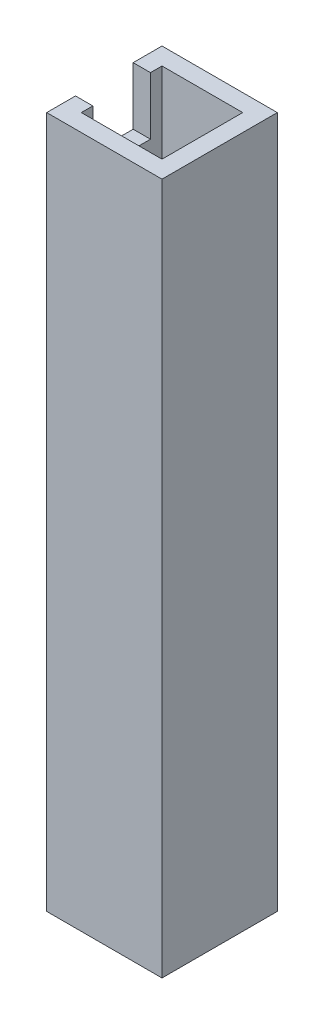
ISO-10303-21;
HEADER;
FILE_DESCRIPTION(('STEP AP214'),'2;1');
FILE_NAME('part.step','',(''),(''),'','','');
FILE_SCHEMA(('AUTOMOTIVE_DESIGN { 1 0 10303 214 1 1 1 1 }'));
ENDSEC;
DATA;
#1=APPLICATION_CONTEXT('core data for automotive mechanical design processes');
#2=APPLICATION_PROTOCOL_DEFINITION('international standard','automotive_design',2000,#1);
#3=PRODUCT_CONTEXT('',#1,'mechanical');
#4=PRODUCT('Part','Part','',(#3));
#5=PRODUCT_RELATED_PRODUCT_CATEGORY('part','',(#4));
#6=PRODUCT_DEFINITION_FORMATION('','',#4);
#7=PRODUCT_DEFINITION_CONTEXT('part definition',#1,'design');
#8=PRODUCT_DEFINITION('design','',#6,#7);
#9=PRODUCT_DEFINITION_SHAPE('','',#8);
#10=(LENGTH_UNIT() NAMED_UNIT(*) SI_UNIT(.MILLI.,.METRE.));
#11=(NAMED_UNIT(*) PLANE_ANGLE_UNIT() SI_UNIT($,.RADIAN.));
#12=(NAMED_UNIT(*) SI_UNIT($,.STERADIAN.) SOLID_ANGLE_UNIT());
#13=UNCERTAINTY_MEASURE_WITH_UNIT(LENGTH_MEASURE(1.E-05),#10,'distance_accuracy_value','');
#14=(GEOMETRIC_REPRESENTATION_CONTEXT(3) GLOBAL_UNCERTAINTY_ASSIGNED_CONTEXT((#13)) GLOBAL_UNIT_ASSIGNED_CONTEXT((#10,
#11,#12)) REPRESENTATION_CONTEXT('',''));
#15=CARTESIAN_POINT('',(0.,0.,0.));
#16=DIRECTION('',(0.,0.,1.));
#17=DIRECTION('',(1.,0.,0.));
#18=AXIS2_PLACEMENT_3D('',#15,#16,#17);
#19=CARTESIAN_POINT('',(0.,120.,0.));
#20=DIRECTION('',(0.,1.,0.));
#21=DIRECTION('',(0.,0.,1.));
#22=AXIS2_PLACEMENT_3D('',#19,#20,#21);
#23=PLANE('',#22);
#24=DIRECTION('',(0.,0.,1.));
#25=VECTOR('',#24,1.);
#26=CARTESIAN_POINT('',(-5.07339449541285,120.,-5.01529051987768));
#27=LINE('',#26,#25);
#28=CARTESIAN_POINT('',(-5.07339449541284,120.,9.98470948012232));
#29=VERTEX_POINT('',#28);
#30=CARTESIAN_POINT('',(-5.07339449541284,120.,11.9847094801223));
#31=VERTEX_POINT('',#30);
#32=EDGE_CURVE('E185',#29,#31,#27,.T.);
#33=ORIENTED_EDGE('',*,*,#32,.F.);
#34=DIRECTION('',(-1.,0.,0.));
#35=VECTOR('',#34,1.);
#36=CARTESIAN_POINT('',(-5.07339449541284,120.,9.98470948012232));
#37=LINE('',#36,#35);
#38=CARTESIAN_POINT('',(-8.07339449541284,120.,9.98470948012232));
#39=VERTEX_POINT('',#38);
#40=EDGE_CURVE('E161',#29,#39,#37,.T.);
#41=ORIENTED_EDGE('',*,*,#40,.T.);
#42=DIRECTION('',(0.,0.,1.));
#43=VECTOR('',#42,1.);
#44=CARTESIAN_POINT('',(-8.07339449541285,120.,-5.01529051987768));
#45=LINE('',#44,#43);
#46=CARTESIAN_POINT('',(-8.07339449541284,120.,14.9847094801223));
#47=VERTEX_POINT('',#46);
#48=EDGE_CURVE('E196',#39,#47,#45,.T.);
#49=ORIENTED_EDGE('',*,*,#48,.T.);
#50=DIRECTION('',(1.,0.,0.));
#51=VECTOR('',#50,1.);
#52=CARTESIAN_POINT('',(-8.07339449541284,120.,14.9847094801223));
#53=LINE('',#52,#51);
#54=CARTESIAN_POINT('',(11.9266055045872,120.,14.9847094801223));
#55=VERTEX_POINT('',#54);
#56=EDGE_CURVE('E197',#47,#55,#53,.T.);
#57=ORIENTED_EDGE('',*,*,#56,.T.);
#58=DIRECTION('',(0.,0.,-1.));
#59=VECTOR('',#58,1.);
#60=CARTESIAN_POINT('',(11.9266055045872,120.,-5.01529051987768));
#61=LINE('',#60,#59);
#62=CARTESIAN_POINT('',(11.9266055045872,120.,-5.01529051987768));
#63=VERTEX_POINT('',#62);
#64=EDGE_CURVE('E199',#55,#63,#61,.T.);
#65=ORIENTED_EDGE('',*,*,#64,.T.);
#66=DIRECTION('',(-1.,0.,0.));
#67=VECTOR('',#66,1.);
#68=CARTESIAN_POINT('',(-8.07339449541285,120.,-5.01529051987768));
#69=LINE('',#68,#67);
#70=CARTESIAN_POINT('',(-8.07339449541285,120.,-5.01529051987768));
#71=VERTEX_POINT('',#70);
#72=EDGE_CURVE('E205',#63,#71,#69,.T.);
#73=ORIENTED_EDGE('',*,*,#72,.T.);
#74=CARTESIAN_POINT('',(-8.07339449541285,120.,-0.0152905198776771));
#75=VERTEX_POINT('',#74);
#76=EDGE_CURVE('E192',#71,#75,#45,.T.);
#77=ORIENTED_EDGE('',*,*,#76,.T.);
#78=DIRECTION('',(-1.,0.,0.));
#79=VECTOR('',#78,1.);
#80=CARTESIAN_POINT('',(-5.07339449541285,120.,-0.0152905198776776));
#81=LINE('',#80,#79);
#82=CARTESIAN_POINT('',(-5.07339449541285,120.,-0.0152905198776776));
#83=VERTEX_POINT('',#82);
#84=EDGE_CURVE('E158',#83,#75,#81,.T.);
#85=ORIENTED_EDGE('',*,*,#84,.F.);
#86=CARTESIAN_POINT('',(-5.07339449541285,120.,-2.01529051987768));
#87=VERTEX_POINT('',#86);
#88=EDGE_CURVE('E149',#87,#83,#27,.T.);
#89=ORIENTED_EDGE('',*,*,#88,.F.);
#90=DIRECTION('',(-1.,0.,0.));
#91=VECTOR('',#90,1.);
#92=CARTESIAN_POINT('',(-8.07339449541285,120.,-2.01529051987768));
#93=LINE('',#92,#91);
#94=CARTESIAN_POINT('',(8.92660550458715,120.,-2.01529051987768));
#95=VERTEX_POINT('',#94);
#96=EDGE_CURVE('E171',#95,#87,#93,.T.);
#97=ORIENTED_EDGE('',*,*,#96,.F.);
#98=DIRECTION('',(0.,0.,-1.));
#99=VECTOR('',#98,1.);
#100=CARTESIAN_POINT('',(8.92660550458715,120.,-5.01529051987768));
#101=LINE('',#100,#99);
#102=CARTESIAN_POINT('',(8.92660550458716,120.,11.9847094801223));
#103=VERTEX_POINT('',#102);
#104=EDGE_CURVE('E191',#103,#95,#101,.T.);
#105=ORIENTED_EDGE('',*,*,#104,.F.);
#106=DIRECTION('',(1.,0.,0.));
#107=VECTOR('',#106,1.);
#108=CARTESIAN_POINT('',(-8.07339449541284,120.,11.9847094801223));
#109=LINE('',#108,#107);
#110=EDGE_CURVE('E188',#31,#103,#109,.T.);
#111=ORIENTED_EDGE('',*,*,#110,.F.);
#112=EDGE_LOOP('',(#33,#41,#49,#57,#65,#73,#77,#85,#89,#97,#105,#111));
#113=FACE_BOUND('',#112,.T.);
#114=ADVANCED_FACE('F39',(#113),#23,.T.);
#115=CARTESIAN_POINT('',(-8.07339449541285,120.,-5.01529051987768));
#116=DIRECTION('',(1.,0.,0.));
#117=DIRECTION('',(0.,0.,-1.));
#118=AXIS2_PLACEMENT_3D('',#115,#116,#117);
#119=PLANE('',#118);
#120=DIRECTION('',(0.,-1.,0.));
#121=VECTOR('',#120,1.);
#122=CARTESIAN_POINT('',(-8.07339449541285,120.,-0.0152905198776771));
#123=LINE('',#122,#121);
#124=CARTESIAN_POINT('',(-8.07339449541285,110.,-0.0152905198776754));
#125=VERTEX_POINT('',#124);
#126=EDGE_CURVE('E133',#75,#125,#123,.T.);
#127=ORIENTED_EDGE('',*,*,#126,.F.);
#128=ORIENTED_EDGE('',*,*,#76,.F.);
#129=DIRECTION('',(0.,-1.,0.));
#130=VECTOR('',#129,1.);
#131=CARTESIAN_POINT('',(-8.07339449541285,120.,-5.01529051987768));
#132=LINE('',#131,#130);
#133=CARTESIAN_POINT('',(-8.07339449541285,0.,-5.01529051987768));
#134=VERTEX_POINT('',#133);
#135=EDGE_CURVE('E204',#71,#134,#132,.T.);
#136=ORIENTED_EDGE('',*,*,#135,.T.);
#137=DIRECTION('',(0.,0.,1.));
#138=VECTOR('',#137,1.);
#139=CARTESIAN_POINT('',(-8.07339449541285,0.,-5.01529051987768));
#140=LINE('',#139,#138);
#141=CARTESIAN_POINT('',(-8.07339449541284,0.,14.9847094801223));
#142=VERTEX_POINT('',#141);
#143=EDGE_CURVE('E169',#134,#142,#140,.T.);
#144=ORIENTED_EDGE('',*,*,#143,.T.);
#145=DIRECTION('',(0.,-1.,0.));
#146=VECTOR('',#145,1.);
#147=CARTESIAN_POINT('',(-8.07339449541284,120.,14.9847094801223));
#148=LINE('',#147,#146);
#149=EDGE_CURVE('E11',#47,#142,#148,.T.);
#150=ORIENTED_EDGE('',*,*,#149,.F.);
#151=ORIENTED_EDGE('',*,*,#48,.F.);
#152=DIRECTION('',(0.,1.,0.));
#153=VECTOR('',#152,1.);
#154=CARTESIAN_POINT('',(-8.07339449541284,120.,9.98470948012232));
#155=LINE('',#154,#153);
#156=CARTESIAN_POINT('',(-8.07339449541284,110.,9.98470948012232));
#157=VERTEX_POINT('',#156);
#158=EDGE_CURVE('E147',#157,#39,#155,.T.);
#159=ORIENTED_EDGE('',*,*,#158,.F.);
#160=DIRECTION('',(0.,0.,1.));
#161=VECTOR('',#160,1.);
#162=CARTESIAN_POINT('',(-8.07339449541285,110.,-0.0152905198776754));
#163=LINE('',#162,#161);
#164=EDGE_CURVE('E155',#125,#157,#163,.T.);
#165=ORIENTED_EDGE('',*,*,#164,.F.);
#166=EDGE_LOOP('',(#127,#128,#136,#144,#150,#151,#159,#165));
#167=FACE_BOUND('',#166,.T.);
#168=ADVANCED_FACE('F41',(#167),#119,.F.);
#169=CARTESIAN_POINT('',(-5.07339449541285,120.,-5.01529051987768));
#170=DIRECTION('',(1.,0.,0.));
#171=DIRECTION('',(0.,0.,-1.));
#172=AXIS2_PLACEMENT_3D('',#169,#170,#171);
#173=PLANE('',#172);
#174=ORIENTED_EDGE('',*,*,#88,.T.);
#175=DIRECTION('',(0.,-1.,0.));
#176=VECTOR('',#175,1.);
#177=CARTESIAN_POINT('',(-5.07339449541285,120.,-0.0152905198776776));
#178=LINE('',#177,#176);
#179=CARTESIAN_POINT('',(-5.07339449541285,110.,-0.0152905198776759));
#180=VERTEX_POINT('',#179);
#181=EDGE_CURVE('E134',#83,#180,#178,.T.);
#182=ORIENTED_EDGE('',*,*,#181,.T.);
#183=DIRECTION('',(0.,0.,1.));
#184=VECTOR('',#183,1.);
#185=CARTESIAN_POINT('',(-5.07339449541285,110.,-0.0152905198776759));
#186=LINE('',#185,#184);
#187=CARTESIAN_POINT('',(-5.07339449541284,110.,9.98470948012232));
#188=VERTEX_POINT('',#187);
#189=EDGE_CURVE('E143',#180,#188,#186,.T.);
#190=ORIENTED_EDGE('',*,*,#189,.T.);
#191=DIRECTION('',(0.,1.,0.));
#192=VECTOR('',#191,1.);
#193=CARTESIAN_POINT('',(-5.07339449541284,120.,9.98470948012232));
#194=LINE('',#193,#192);
#195=EDGE_CURVE('E53',#188,#29,#194,.T.);
#196=ORIENTED_EDGE('',*,*,#195,.T.);
#197=ORIENTED_EDGE('',*,*,#32,.T.);
#198=DIRECTION('',(0.,-1.,0.));
#199=VECTOR('',#198,1.);
#200=CARTESIAN_POINT('',(-5.07339449541284,120.,11.9847094801223));
#201=LINE('',#200,#199);
#202=CARTESIAN_POINT('',(-5.07339449541284,0.,11.9847094801223));
#203=VERTEX_POINT('',#202);
#204=EDGE_CURVE('E164',#31,#203,#201,.T.);
#205=ORIENTED_EDGE('',*,*,#204,.T.);
#206=DIRECTION('',(0.,0.,1.));
#207=VECTOR('',#206,1.);
#208=CARTESIAN_POINT('',(-5.07339449541285,0.,-5.01529051987768));
#209=LINE('',#208,#207);
#210=CARTESIAN_POINT('',(-5.07339449541285,0.,-2.01529051987768));
#211=VERTEX_POINT('',#210);
#212=EDGE_CURVE('E159',#211,#203,#209,.T.);
#213=ORIENTED_EDGE('',*,*,#212,.F.);
#214=DIRECTION('',(0.,-1.,0.));
#215=VECTOR('',#214,1.);
#216=CARTESIAN_POINT('',(-5.07339449541285,120.,-2.01529051987768));
#217=LINE('',#216,#215);
#218=EDGE_CURVE('E168',#87,#211,#217,.T.);
#219=ORIENTED_EDGE('',*,*,#218,.F.);
#220=EDGE_LOOP('',(#174,#182,#190,#196,#197,#205,#213,#219));
#221=FACE_BOUND('',#220,.T.);
#222=ADVANCED_FACE('F148',(#221),#173,.T.);
#223=CARTESIAN_POINT('',(-8.07339449541284,120.,14.9847094801223));
#224=DIRECTION('',(0.,0.,-1.));
#225=DIRECTION('',(-1.,0.,0.));
#226=AXIS2_PLACEMENT_3D('',#223,#224,#225);
#227=PLANE('',#226);
#228=DIRECTION('',(1.,0.,0.));
#229=VECTOR('',#228,1.);
#230=CARTESIAN_POINT('',(-8.07339449541284,0.,14.9847094801223));
#231=LINE('',#230,#229);
#232=CARTESIAN_POINT('',(11.9266055045872,0.,14.9847094801223));
#233=VERTEX_POINT('',#232);
#234=EDGE_CURVE('E210',#142,#233,#231,.T.);
#235=ORIENTED_EDGE('',*,*,#234,.T.);
#236=DIRECTION('',(0.,-1.,0.));
#237=VECTOR('',#236,1.);
#238=CARTESIAN_POINT('',(11.9266055045872,120.,14.9847094801223));
#239=LINE('',#238,#237);
#240=EDGE_CURVE('E50',#55,#233,#239,.T.);
#241=ORIENTED_EDGE('',*,*,#240,.F.);
#242=ORIENTED_EDGE('',*,*,#56,.F.);
#243=ORIENTED_EDGE('',*,*,#149,.T.);
#244=EDGE_LOOP('',(#235,#241,#242,#243));
#245=FACE_BOUND('',#244,.T.);
#246=ADVANCED_FACE('F238',(#245),#227,.F.);
#247=CARTESIAN_POINT('',(11.9266055045872,120.,-5.01529051987768));
#248=DIRECTION('',(-1.,0.,0.));
#249=DIRECTION('',(0.,0.,1.));
#250=AXIS2_PLACEMENT_3D('',#247,#248,#249);
#251=PLANE('',#250);
#252=DIRECTION('',(0.,0.,-1.));
#253=VECTOR('',#252,1.);
#254=CARTESIAN_POINT('',(11.9266055045872,0.,-5.01529051987768));
#255=LINE('',#254,#253);
#256=CARTESIAN_POINT('',(11.9266055045872,0.,-5.01529051987768));
#257=VERTEX_POINT('',#256);
#258=EDGE_CURVE('E207',#233,#257,#255,.T.);
#259=ORIENTED_EDGE('',*,*,#258,.T.);
#260=DIRECTION('',(0.,-1.,0.));
#261=VECTOR('',#260,1.);
#262=CARTESIAN_POINT('',(11.9266055045872,120.,-5.01529051987768));
#263=LINE('',#262,#261);
#264=EDGE_CURVE('E214',#63,#257,#263,.T.);
#265=ORIENTED_EDGE('',*,*,#264,.F.);
#266=ORIENTED_EDGE('',*,*,#64,.F.);
#267=ORIENTED_EDGE('',*,*,#240,.T.);
#268=EDGE_LOOP('',(#259,#265,#266,#267));
#269=FACE_BOUND('',#268,.T.);
#270=ADVANCED_FACE('F225',(#269),#251,.F.);
#271=CARTESIAN_POINT('',(-8.07339449541285,120.,-5.01529051987768));
#272=DIRECTION('',(0.,0.,1.));
#273=DIRECTION('',(1.,0.,0.));
#274=AXIS2_PLACEMENT_3D('',#271,#272,#273);
#275=PLANE('',#274);
#276=DIRECTION('',(-1.,0.,0.));
#277=VECTOR('',#276,1.);
#278=CARTESIAN_POINT('',(-8.07339449541285,0.,-5.01529051987768));
#279=LINE('',#278,#277);
#280=EDGE_CURVE('E211',#257,#134,#279,.T.);
#281=ORIENTED_EDGE('',*,*,#280,.T.);
#282=ORIENTED_EDGE('',*,*,#135,.F.);
#283=ORIENTED_EDGE('',*,*,#72,.F.);
#284=ORIENTED_EDGE('',*,*,#264,.T.);
#285=EDGE_LOOP('',(#281,#282,#283,#284));
#286=FACE_BOUND('',#285,.T.);
#287=ADVANCED_FACE('F235',(#286),#275,.F.);
#288=CARTESIAN_POINT('',(0.,0.,0.));
#289=DIRECTION('',(0.,1.,0.));
#290=DIRECTION('',(0.,0.,1.));
#291=AXIS2_PLACEMENT_3D('',#288,#289,#290);
#292=PLANE('',#291);
#293=DIRECTION('',(-1.,0.,0.));
#294=VECTOR('',#293,1.);
#295=CARTESIAN_POINT('',(-8.07339449541285,0.,-2.01529051987768));
#296=LINE('',#295,#294);
#297=CARTESIAN_POINT('',(8.92660550458715,0.,-2.01529051987768));
#298=VERTEX_POINT('',#297);
#299=EDGE_CURVE('E177',#298,#211,#296,.T.);
#300=ORIENTED_EDGE('',*,*,#299,.T.);
#301=ORIENTED_EDGE('',*,*,#212,.T.);
#302=DIRECTION('',(1.,0.,0.));
#303=VECTOR('',#302,1.);
#304=CARTESIAN_POINT('',(-8.07339449541284,0.,11.9847094801223));
#305=LINE('',#304,#303);
#306=CARTESIAN_POINT('',(8.92660550458716,0.,11.9847094801223));
#307=VERTEX_POINT('',#306);
#308=EDGE_CURVE('E178',#203,#307,#305,.T.);
#309=ORIENTED_EDGE('',*,*,#308,.T.);
#310=DIRECTION('',(0.,0.,-1.));
#311=VECTOR('',#310,1.);
#312=CARTESIAN_POINT('',(8.92660550458715,0.,-5.01529051987768));
#313=LINE('',#312,#311);
#314=EDGE_CURVE('E181',#307,#298,#313,.T.);
#315=ORIENTED_EDGE('',*,*,#314,.T.);
#316=EDGE_LOOP('',(#300,#301,#309,#315));
#317=FACE_BOUND('',#316,.T.);
#318=ORIENTED_EDGE('',*,*,#143,.F.);
#319=ORIENTED_EDGE('',*,*,#280,.F.);
#320=ORIENTED_EDGE('',*,*,#258,.F.);
#321=ORIENTED_EDGE('',*,*,#234,.F.);
#322=EDGE_LOOP('',(#318,#319,#320,#321));
#323=FACE_BOUND('',#322,.T.);
#324=ADVANCED_FACE('F228',(#317,#323),#292,.F.);
#325=CARTESIAN_POINT('',(-8.07339449541284,120.,11.9847094801223));
#326=DIRECTION('',(0.,0.,-1.));
#327=DIRECTION('',(-1.,0.,0.));
#328=AXIS2_PLACEMENT_3D('',#325,#326,#327);
#329=PLANE('',#328);
#330=ORIENTED_EDGE('',*,*,#308,.F.);
#331=ORIENTED_EDGE('',*,*,#204,.F.);
#332=ORIENTED_EDGE('',*,*,#110,.T.);
#333=DIRECTION('',(0.,-1.,0.));
#334=VECTOR('',#333,1.);
#335=CARTESIAN_POINT('',(8.92660550458716,120.,11.9847094801223));
#336=LINE('',#335,#334);
#337=EDGE_CURVE('E166',#103,#307,#336,.T.);
#338=ORIENTED_EDGE('',*,*,#337,.T.);
#339=EDGE_LOOP('',(#330,#331,#332,#338));
#340=FACE_BOUND('',#339,.T.);
#341=ADVANCED_FACE('F248',(#340),#329,.T.);
#342=CARTESIAN_POINT('',(8.92660550458715,120.,-5.01529051987768));
#343=DIRECTION('',(-1.,0.,0.));
#344=DIRECTION('',(0.,0.,1.));
#345=AXIS2_PLACEMENT_3D('',#342,#343,#344);
#346=PLANE('',#345);
#347=ORIENTED_EDGE('',*,*,#314,.F.);
#348=ORIENTED_EDGE('',*,*,#337,.F.);
#349=ORIENTED_EDGE('',*,*,#104,.T.);
#350=DIRECTION('',(0.,-1.,0.));
#351=VECTOR('',#350,1.);
#352=CARTESIAN_POINT('',(8.92660550458715,120.,-2.01529051987768));
#353=LINE('',#352,#351);
#354=EDGE_CURVE('E61',#95,#298,#353,.T.);
#355=ORIENTED_EDGE('',*,*,#354,.T.);
#356=EDGE_LOOP('',(#347,#348,#349,#355));
#357=FACE_BOUND('',#356,.T.);
#358=ADVANCED_FACE('F255',(#357),#346,.T.);
#359=CARTESIAN_POINT('',(-8.07339449541285,120.,-2.01529051987768));
#360=DIRECTION('',(0.,0.,1.));
#361=DIRECTION('',(1.,0.,0.));
#362=AXIS2_PLACEMENT_3D('',#359,#360,#361);
#363=PLANE('',#362);
#364=ORIENTED_EDGE('',*,*,#299,.F.);
#365=ORIENTED_EDGE('',*,*,#354,.F.);
#366=ORIENTED_EDGE('',*,*,#96,.T.);
#367=ORIENTED_EDGE('',*,*,#218,.T.);
#368=EDGE_LOOP('',(#364,#365,#366,#367));
#369=FACE_BOUND('',#368,.T.);
#370=ADVANCED_FACE('F252',(#369),#363,.T.);
#371=CARTESIAN_POINT('',(-5.07339449541285,120.,-0.0152905198776776));
#372=DIRECTION('',(0.,0.,-1.));
#373=DIRECTION('',(-1.,0.,0.));
#374=AXIS2_PLACEMENT_3D('',#371,#372,#373);
#375=PLANE('',#374);
#376=ORIENTED_EDGE('',*,*,#126,.T.);
#377=DIRECTION('',(-1.,0.,0.));
#378=VECTOR('',#377,1.);
#379=CARTESIAN_POINT('',(-5.07339449541285,110.,-0.0152905198776759));
#380=LINE('',#379,#378);
#381=EDGE_CURVE('E130',#180,#125,#380,.T.);
#382=ORIENTED_EDGE('',*,*,#381,.F.);
#383=ORIENTED_EDGE('',*,*,#181,.F.);
#384=ORIENTED_EDGE('',*,*,#84,.T.);
#385=EDGE_LOOP('',(#376,#382,#383,#384));
#386=FACE_BOUND('',#385,.T.);
#387=ADVANCED_FACE('F129',(#386),#375,.F.);
#388=CARTESIAN_POINT('',(-5.07339449541284,120.,9.98470948012232));
#389=DIRECTION('',(0.,0.,1.));
#390=DIRECTION('',(1.,0.,0.));
#391=AXIS2_PLACEMENT_3D('',#388,#389,#390);
#392=PLANE('',#391);
#393=ORIENTED_EDGE('',*,*,#158,.T.);
#394=ORIENTED_EDGE('',*,*,#40,.F.);
#395=ORIENTED_EDGE('',*,*,#195,.F.);
#396=DIRECTION('',(-1.,0.,0.));
#397=VECTOR('',#396,1.);
#398=CARTESIAN_POINT('',(-5.07339449541284,110.,9.98470948012232));
#399=LINE('',#398,#397);
#400=EDGE_CURVE('E138',#188,#157,#399,.T.);
#401=ORIENTED_EDGE('',*,*,#400,.T.);
#402=EDGE_LOOP('',(#393,#394,#395,#401));
#403=FACE_BOUND('',#402,.T.);
#404=ADVANCED_FACE('F241',(#403),#392,.F.);
#405=CARTESIAN_POINT('',(-5.07339449541285,110.,-0.0152905198776759));
#406=DIRECTION('',(0.,-1.,0.));
#407=DIRECTION('',(0.,0.,-1.));
#408=AXIS2_PLACEMENT_3D('',#405,#406,#407);
#409=PLANE('',#408);
#410=ORIENTED_EDGE('',*,*,#164,.T.);
#411=ORIENTED_EDGE('',*,*,#400,.F.);
#412=ORIENTED_EDGE('',*,*,#189,.F.);
#413=ORIENTED_EDGE('',*,*,#381,.T.);
#414=EDGE_LOOP('',(#410,#411,#412,#413));
#415=FACE_BOUND('',#414,.T.);
#416=ADVANCED_FACE('F142',(#415),#409,.F.);
#417=CLOSED_SHELL('',(#114,#168,#222,#246,#270,#287,#324,#341,#358,#370,#387,#404,#416));
#418=MANIFOLD_SOLID_BREP('B2',#417);
#419=ADVANCED_BREP_SHAPE_REPRESENTATION('',(#18,#418),#14);
#420=SHAPE_DEFINITION_REPRESENTATION(#9,#419);
ENDSEC;
END-ISO-10303-21;
